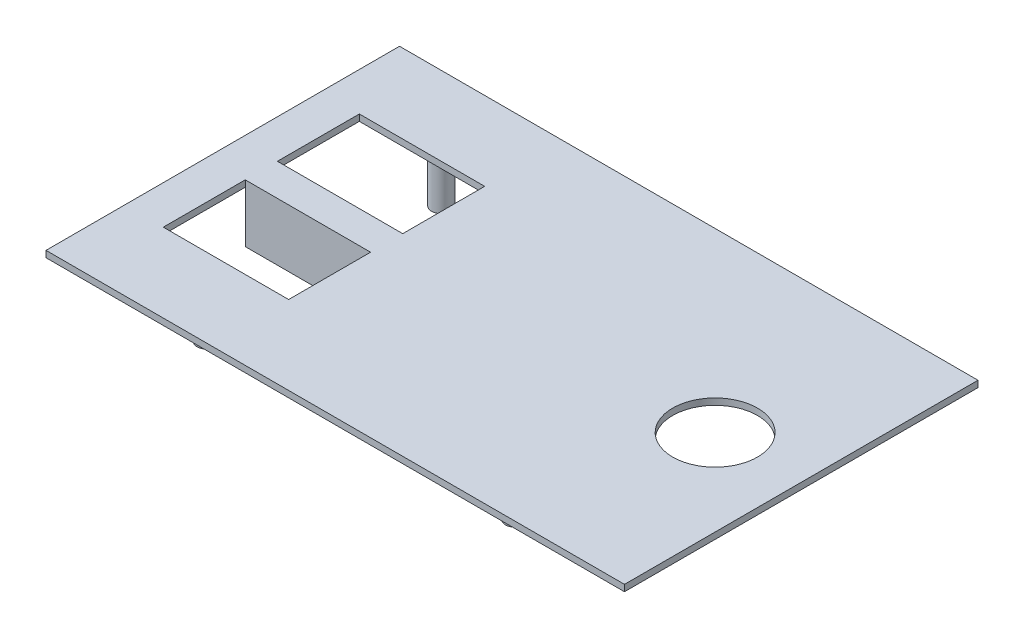
ISO-10303-21;
HEADER;
FILE_DESCRIPTION(('STEP AP214'),'2;1');
FILE_NAME('part.step','',(''),(''),'','','');
FILE_SCHEMA(('AUTOMOTIVE_DESIGN { 1 0 10303 214 1 1 1 1 }'));
ENDSEC;
DATA;
#1=APPLICATION_CONTEXT('core data for automotive mechanical design processes');
#2=APPLICATION_PROTOCOL_DEFINITION('international standard','automotive_design',2000,#1);
#3=PRODUCT_CONTEXT('',#1,'mechanical');
#4=PRODUCT('Part','Part','',(#3));
#5=PRODUCT_RELATED_PRODUCT_CATEGORY('part','',(#4));
#6=PRODUCT_DEFINITION_FORMATION('','',#4);
#7=PRODUCT_DEFINITION_CONTEXT('part definition',#1,'design');
#8=PRODUCT_DEFINITION('design','',#6,#7);
#9=PRODUCT_DEFINITION_SHAPE('','',#8);
#10=(LENGTH_UNIT() NAMED_UNIT(*) SI_UNIT(.MILLI.,.METRE.));
#11=(NAMED_UNIT(*) PLANE_ANGLE_UNIT() SI_UNIT($,.RADIAN.));
#12=(NAMED_UNIT(*) SI_UNIT($,.STERADIAN.) SOLID_ANGLE_UNIT());
#13=UNCERTAINTY_MEASURE_WITH_UNIT(LENGTH_MEASURE(1.E-05),#10,'distance_accuracy_value','');
#14=(GEOMETRIC_REPRESENTATION_CONTEXT(3) GLOBAL_UNCERTAINTY_ASSIGNED_CONTEXT((#13)) GLOBAL_UNIT_ASSIGNED_CONTEXT((#10,
#11,#12)) REPRESENTATION_CONTEXT('',''));
#15=CARTESIAN_POINT('',(0.,0.,0.));
#16=DIRECTION('',(0.,0.,1.));
#17=DIRECTION('',(1.,0.,0.));
#18=AXIS2_PLACEMENT_3D('',#15,#16,#17);
#19=CARTESIAN_POINT('',(0.,0.,0.));
#20=DIRECTION('',(0.,-1.,0.));
#21=DIRECTION('',(0.,0.,-1.));
#22=AXIS2_PLACEMENT_3D('',#19,#20,#21);
#23=PLANE('',#22);
#24=CARTESIAN_POINT('',(63.75,0.,-27.4111267518974));
#25=DIRECTION('',(0.,-1.,0.));
#26=DIRECTION('',(0.,0.,-1.));
#27=AXIS2_PLACEMENT_3D('',#24,#25,#26);
#28=CIRCLE('',#27,1.5);
#29=CARTESIAN_POINT('',(63.75,0.,-28.9111267518974));
#30=VERTEX_POINT('',#29);
#31=EDGE_CURVE('E546',#30,#30,#28,.T.);
#32=ORIENTED_EDGE('',*,*,#31,.F.);
#33=EDGE_LOOP('',(#32));
#34=FACE_BOUND('',#33,.T.);
#35=CARTESIAN_POINT('',(63.75,0.,-45.75));
#36=DIRECTION('',(0.,-1.,0.));
#37=DIRECTION('',(0.,0.,-1.));
#38=AXIS2_PLACEMENT_3D('',#35,#36,#37);
#39=CIRCLE('',#38,1.5);
#40=CARTESIAN_POINT('',(63.75,0.,-47.25));
#41=VERTEX_POINT('',#40);
#42=EDGE_CURVE('E162',#41,#41,#39,.T.);
#43=ORIENTED_EDGE('',*,*,#42,.F.);
#44=EDGE_LOOP('',(#43));
#45=FACE_BOUND('',#44,.T.);
#46=CARTESIAN_POINT('',(15.75,0.,-45.75));
#47=DIRECTION('',(0.,-1.,0.));
#48=DIRECTION('',(0.,0.,-1.));
#49=AXIS2_PLACEMENT_3D('',#46,#47,#48);
#50=CIRCLE('',#49,1.5);
#51=CARTESIAN_POINT('',(15.75,0.,-47.25));
#52=VERTEX_POINT('',#51);
#53=EDGE_CURVE('E177',#52,#52,#50,.T.);
#54=ORIENTED_EDGE('',*,*,#53,.F.);
#55=EDGE_LOOP('',(#54));
#56=FACE_BOUND('',#55,.T.);
#57=CARTESIAN_POINT('',(76.6,0.,-27.5));
#58=DIRECTION('',(0.,1.,0.));
#59=DIRECTION('',(0.,0.,1.));
#60=AXIS2_PLACEMENT_3D('',#57,#58,#59);
#61=CIRCLE('',#60,6.59999999999999);
#62=CARTESIAN_POINT('',(76.6,0.,-20.9));
#63=VERTEX_POINT('',#62);
#64=EDGE_CURVE('E195',#63,#63,#61,.T.);
#65=ORIENTED_EDGE('',*,*,#64,.T.);
#66=EDGE_LOOP('',(#65));
#67=FACE_BOUND('',#66,.T.);
#68=DIRECTION('',(0.,0.,1.));
#69=VECTOR('',#68,1.);
#70=CARTESIAN_POINT('',(0.,0.,0.));
#71=LINE('',#70,#69);
#72=CARTESIAN_POINT('',(0.,0.,-55.));
#73=VERTEX_POINT('',#72);
#74=CARTESIAN_POINT('',(0.,0.,0.));
#75=VERTEX_POINT('',#74);
#76=EDGE_CURVE('E247',#73,#75,#71,.T.);
#77=ORIENTED_EDGE('',*,*,#76,.F.);
#78=DIRECTION('',(-1.,0.,0.));
#79=VECTOR('',#78,1.);
#80=CARTESIAN_POINT('',(0.,0.,-55.));
#81=LINE('',#80,#79);
#82=CARTESIAN_POINT('',(90.,0.,-55.));
#83=VERTEX_POINT('',#82);
#84=EDGE_CURVE('E257',#83,#73,#81,.T.);
#85=ORIENTED_EDGE('',*,*,#84,.F.);
#86=DIRECTION('',(0.,0.,-1.));
#87=VECTOR('',#86,1.);
#88=CARTESIAN_POINT('',(90.,0.,0.));
#89=LINE('',#88,#87);
#90=CARTESIAN_POINT('',(90.,0.,0.));
#91=VERTEX_POINT('',#90);
#92=EDGE_CURVE('E268',#91,#83,#89,.T.);
#93=ORIENTED_EDGE('',*,*,#92,.F.);
#94=DIRECTION('',(1.,0.,0.));
#95=VECTOR('',#94,1.);
#96=CARTESIAN_POINT('',(0.,0.,0.));
#97=LINE('',#96,#95);
#98=EDGE_CURVE('E266',#75,#91,#97,.T.);
#99=ORIENTED_EDGE('',*,*,#98,.F.);
#100=EDGE_LOOP('',(#77,#85,#93,#99));
#101=FACE_BOUND('',#100,.T.);
#102=CARTESIAN_POINT('',(15.75,0.,-9.25));
#103=DIRECTION('',(0.,-1.,0.));
#104=DIRECTION('',(0.,0.,-1.));
#105=AXIS2_PLACEMENT_3D('',#102,#103,#104);
#106=CIRCLE('',#105,1.5);
#107=CARTESIAN_POINT('',(15.75,0.,-10.75));
#108=VERTEX_POINT('',#107);
#109=EDGE_CURVE('E188',#108,#108,#106,.T.);
#110=ORIENTED_EDGE('',*,*,#109,.F.);
#111=EDGE_LOOP('',(#110));
#112=FACE_BOUND('',#111,.T.);
#113=CARTESIAN_POINT('',(63.75,0.,-9.25));
#114=DIRECTION('',(0.,-1.,0.));
#115=DIRECTION('',(0.,0.,-1.));
#116=AXIS2_PLACEMENT_3D('',#113,#114,#115);
#117=CIRCLE('',#116,1.5);
#118=CARTESIAN_POINT('',(63.75,0.,-10.75));
#119=VERTEX_POINT('',#118);
#120=EDGE_CURVE('E172',#119,#119,#117,.T.);
#121=ORIENTED_EDGE('',*,*,#120,.F.);
#122=EDGE_LOOP('',(#121));
#123=FACE_BOUND('',#122,.T.);
#124=DIRECTION('',(0.,0.,1.));
#125=VECTOR('',#124,1.);
#126=CARTESIAN_POINT('',(6.,0.,-42.75));
#127=LINE('',#126,#125);
#128=CARTESIAN_POINT('',(6.,0.,-42.75));
#129=VERTEX_POINT('',#128);
#130=CARTESIAN_POINT('',(6.00000000000001,0.,-30.));
#131=VERTEX_POINT('',#130);
#132=EDGE_CURVE('E226',#129,#131,#127,.T.);
#133=ORIENTED_EDGE('',*,*,#132,.T.);
#134=DIRECTION('',(0.,0.,-1.));
#135=VECTOR('',#134,1.);
#136=CARTESIAN_POINT('',(6.,0.,-25.));
#137=LINE('',#136,#135);
#138=CARTESIAN_POINT('',(6.,0.,-25.));
#139=VERTEX_POINT('',#138);
#140=EDGE_CURVE('E161',#139,#131,#137,.T.);
#141=ORIENTED_EDGE('',*,*,#140,.F.);
#142=DIRECTION('',(0.,0.,1.));
#143=VECTOR('',#142,1.);
#144=CARTESIAN_POINT('',(6.,0.,-25.));
#145=LINE('',#144,#143);
#146=CARTESIAN_POINT('',(6.,0.,-12.25));
#147=VERTEX_POINT('',#146);
#148=EDGE_CURVE('E200',#139,#147,#145,.T.);
#149=ORIENTED_EDGE('',*,*,#148,.T.);
#150=DIRECTION('',(1.,0.,0.));
#151=VECTOR('',#150,1.);
#152=CARTESIAN_POINT('',(6.,0.,-12.25));
#153=LINE('',#152,#151);
#154=CARTESIAN_POINT('',(25.5,0.,-12.25));
#155=VERTEX_POINT('',#154);
#156=EDGE_CURVE('E203',#147,#155,#153,.T.);
#157=ORIENTED_EDGE('',*,*,#156,.T.);
#158=DIRECTION('',(0.,0.,-1.));
#159=VECTOR('',#158,1.);
#160=CARTESIAN_POINT('',(25.5,0.,-25.));
#161=LINE('',#160,#159);
#162=CARTESIAN_POINT('',(25.5,0.,-25.));
#163=VERTEX_POINT('',#162);
#164=EDGE_CURVE('E56',#155,#163,#161,.T.);
#165=ORIENTED_EDGE('',*,*,#164,.T.);
#166=DIRECTION('',(0.,0.,1.));
#167=VECTOR('',#166,1.);
#168=CARTESIAN_POINT('',(25.5,0.,-25.));
#169=LINE('',#168,#167);
#170=CARTESIAN_POINT('',(25.5,0.,-30.));
#171=VERTEX_POINT('',#170);
#172=EDGE_CURVE('E157',#171,#163,#169,.T.);
#173=ORIENTED_EDGE('',*,*,#172,.F.);
#174=DIRECTION('',(0.,0.,-1.));
#175=VECTOR('',#174,1.);
#176=CARTESIAN_POINT('',(25.5,0.,-42.75));
#177=LINE('',#176,#175);
#178=CARTESIAN_POINT('',(25.5,0.,-42.75));
#179=VERTEX_POINT('',#178);
#180=EDGE_CURVE('E229',#171,#179,#177,.T.);
#181=ORIENTED_EDGE('',*,*,#180,.T.);
#182=DIRECTION('',(-1.,0.,0.));
#183=VECTOR('',#182,1.);
#184=CARTESIAN_POINT('',(6.,0.,-42.75));
#185=LINE('',#184,#183);
#186=EDGE_CURVE('E233',#179,#129,#185,.T.);
#187=ORIENTED_EDGE('',*,*,#186,.T.);
#188=EDGE_LOOP('',(#133,#141,#149,#157,#165,#173,#181,#187));
#189=FACE_BOUND('',#188,.T.);
#190=CARTESIAN_POINT('',(42.2893659328708,0.,-27.4111267518974));
#191=DIRECTION('',(0.,-1.,0.));
#192=DIRECTION('',(0.,0.,-1.));
#193=AXIS2_PLACEMENT_3D('',#190,#191,#192);
#194=CIRCLE('',#193,1.5);
#195=CARTESIAN_POINT('',(42.2893659328708,0.,-28.9111267518974));
#196=VERTEX_POINT('',#195);
#197=EDGE_CURVE('E547',#196,#196,#194,.T.);
#198=ORIENTED_EDGE('',*,*,#197,.F.);
#199=EDGE_LOOP('',(#198));
#200=FACE_BOUND('',#199,.T.);
#201=ADVANCED_FACE('F33',(#34,#45,#56,#67,#101,#112,#123,#189,#200),#23,.T.);
#202=CARTESIAN_POINT('',(0.,1.,0.));
#203=DIRECTION('',(1.,0.,0.));
#204=DIRECTION('',(0.,0.,-1.));
#205=AXIS2_PLACEMENT_3D('',#202,#203,#204);
#206=PLANE('',#205);
#207=ORIENTED_EDGE('',*,*,#76,.T.);
#208=DIRECTION('',(0.,-1.,0.));
#209=VECTOR('',#208,1.);
#210=CARTESIAN_POINT('',(0.,1.,0.));
#211=LINE('',#210,#209);
#212=CARTESIAN_POINT('',(0.,1.,0.));
#213=VERTEX_POINT('',#212);
#214=EDGE_CURVE('E41',#213,#75,#211,.T.);
#215=ORIENTED_EDGE('',*,*,#214,.F.);
#216=DIRECTION('',(0.,0.,1.));
#217=VECTOR('',#216,1.);
#218=CARTESIAN_POINT('',(0.,1.,0.));
#219=LINE('',#218,#217);
#220=CARTESIAN_POINT('',(0.,1.,-55.));
#221=VERTEX_POINT('',#220);
#222=EDGE_CURVE('E253',#221,#213,#219,.T.);
#223=ORIENTED_EDGE('',*,*,#222,.F.);
#224=DIRECTION('',(0.,-1.,0.));
#225=VECTOR('',#224,1.);
#226=CARTESIAN_POINT('',(0.,1.,-55.));
#227=LINE('',#226,#225);
#228=EDGE_CURVE('E263',#221,#73,#227,.T.);
#229=ORIENTED_EDGE('',*,*,#228,.T.);
#230=EDGE_LOOP('',(#207,#215,#223,#229));
#231=FACE_BOUND('',#230,.T.);
#232=ADVANCED_FACE('F35',(#231),#206,.F.);
#233=CARTESIAN_POINT('',(0.,1.,0.));
#234=DIRECTION('',(0.,0.,-1.));
#235=DIRECTION('',(-1.,0.,0.));
#236=AXIS2_PLACEMENT_3D('',#233,#234,#235);
#237=PLANE('',#236);
#238=ORIENTED_EDGE('',*,*,#98,.T.);
#239=DIRECTION('',(0.,-1.,0.));
#240=VECTOR('',#239,1.);
#241=CARTESIAN_POINT('',(90.,1.,0.));
#242=LINE('',#241,#240);
#243=CARTESIAN_POINT('',(90.,1.,0.));
#244=VERTEX_POINT('',#243);
#245=EDGE_CURVE('E276',#244,#91,#242,.T.);
#246=ORIENTED_EDGE('',*,*,#245,.F.);
#247=DIRECTION('',(1.,0.,0.));
#248=VECTOR('',#247,1.);
#249=CARTESIAN_POINT('',(0.,1.,0.));
#250=LINE('',#249,#248);
#251=EDGE_CURVE('E256',#213,#244,#250,.T.);
#252=ORIENTED_EDGE('',*,*,#251,.F.);
#253=ORIENTED_EDGE('',*,*,#214,.T.);
#254=EDGE_LOOP('',(#238,#246,#252,#253));
#255=FACE_BOUND('',#254,.T.);
#256=ADVANCED_FACE('F281',(#255),#237,.F.);
#257=CARTESIAN_POINT('',(90.,1.,0.));
#258=DIRECTION('',(-1.,0.,0.));
#259=DIRECTION('',(0.,0.,1.));
#260=AXIS2_PLACEMENT_3D('',#257,#258,#259);
#261=PLANE('',#260);
#262=ORIENTED_EDGE('',*,*,#92,.T.);
#263=DIRECTION('',(0.,-1.,0.));
#264=VECTOR('',#263,1.);
#265=CARTESIAN_POINT('',(90.,1.,-55.));
#266=LINE('',#265,#264);
#267=CARTESIAN_POINT('',(90.,1.,-55.));
#268=VERTEX_POINT('',#267);
#269=EDGE_CURVE('E273',#268,#83,#266,.T.);
#270=ORIENTED_EDGE('',*,*,#269,.F.);
#271=DIRECTION('',(0.,0.,-1.));
#272=VECTOR('',#271,1.);
#273=CARTESIAN_POINT('',(90.,1.,0.));
#274=LINE('',#273,#272);
#275=EDGE_CURVE('E259',#244,#268,#274,.T.);
#276=ORIENTED_EDGE('',*,*,#275,.F.);
#277=ORIENTED_EDGE('',*,*,#245,.T.);
#278=EDGE_LOOP('',(#262,#270,#276,#277));
#279=FACE_BOUND('',#278,.T.);
#280=ADVANCED_FACE('F293',(#279),#261,.F.);
#281=CARTESIAN_POINT('',(0.,1.,-55.));
#282=DIRECTION('',(0.,0.,1.));
#283=DIRECTION('',(1.,0.,0.));
#284=AXIS2_PLACEMENT_3D('',#281,#282,#283);
#285=PLANE('',#284);
#286=ORIENTED_EDGE('',*,*,#84,.T.);
#287=ORIENTED_EDGE('',*,*,#228,.F.);
#288=DIRECTION('',(-1.,0.,0.));
#289=VECTOR('',#288,1.);
#290=CARTESIAN_POINT('',(0.,1.,-55.));
#291=LINE('',#290,#289);
#292=EDGE_CURVE('E261',#268,#221,#291,.T.);
#293=ORIENTED_EDGE('',*,*,#292,.F.);
#294=ORIENTED_EDGE('',*,*,#269,.T.);
#295=EDGE_LOOP('',(#286,#287,#293,#294));
#296=FACE_BOUND('',#295,.T.);
#297=ADVANCED_FACE('F297',(#296),#285,.F.);
#298=CARTESIAN_POINT('',(0.,1.,0.));
#299=DIRECTION('',(0.,-1.,0.));
#300=DIRECTION('',(0.,0.,-1.));
#301=AXIS2_PLACEMENT_3D('',#298,#299,#300);
#302=PLANE('',#301);
#303=CARTESIAN_POINT('',(76.6,1.,-27.5));
#304=DIRECTION('',(0.,1.,0.));
#305=DIRECTION('',(0.,0.,1.));
#306=AXIS2_PLACEMENT_3D('',#303,#304,#305);
#307=CIRCLE('',#306,6.59999999999999);
#308=CARTESIAN_POINT('',(76.6,1.,-20.9));
#309=VERTEX_POINT('',#308);
#310=EDGE_CURVE('E192',#309,#309,#307,.T.);
#311=ORIENTED_EDGE('',*,*,#310,.F.);
#312=EDGE_LOOP('',(#311));
#313=FACE_BOUND('',#312,.T.);
#314=DIRECTION('',(1.,0.,0.));
#315=VECTOR('',#314,1.);
#316=CARTESIAN_POINT('',(6.,1.,-12.25));
#317=LINE('',#316,#315);
#318=CARTESIAN_POINT('',(6.,1.,-12.25));
#319=VERTEX_POINT('',#318);
#320=CARTESIAN_POINT('',(25.5,1.,-12.25));
#321=VERTEX_POINT('',#320);
#322=EDGE_CURVE('E210',#319,#321,#317,.T.);
#323=ORIENTED_EDGE('',*,*,#322,.F.);
#324=DIRECTION('',(0.,0.,1.));
#325=VECTOR('',#324,1.);
#326=CARTESIAN_POINT('',(6.,1.,-25.));
#327=LINE('',#326,#325);
#328=CARTESIAN_POINT('',(6.,1.,-25.));
#329=VERTEX_POINT('',#328);
#330=EDGE_CURVE('E48',#329,#319,#327,.T.);
#331=ORIENTED_EDGE('',*,*,#330,.F.);
#332=DIRECTION('',(-1.,0.,0.));
#333=VECTOR('',#332,1.);
#334=CARTESIAN_POINT('',(6.,1.,-25.));
#335=LINE('',#334,#333);
#336=CARTESIAN_POINT('',(25.5,1.,-25.));
#337=VERTEX_POINT('',#336);
#338=EDGE_CURVE('E204',#337,#329,#335,.T.);
#339=ORIENTED_EDGE('',*,*,#338,.F.);
#340=DIRECTION('',(0.,0.,-1.));
#341=VECTOR('',#340,1.);
#342=CARTESIAN_POINT('',(25.5,1.,-25.));
#343=LINE('',#342,#341);
#344=EDGE_CURVE('E213',#321,#337,#343,.T.);
#345=ORIENTED_EDGE('',*,*,#344,.F.);
#346=EDGE_LOOP('',(#323,#331,#339,#345));
#347=FACE_BOUND('',#346,.T.);
#348=DIRECTION('',(1.,0.,0.));
#349=VECTOR('',#348,1.);
#350=CARTESIAN_POINT('',(6.00000000000001,1.,-30.));
#351=LINE('',#350,#349);
#352=CARTESIAN_POINT('',(6.00000000000001,1.,-30.));
#353=VERTEX_POINT('',#352);
#354=CARTESIAN_POINT('',(25.5,1.,-30.));
#355=VERTEX_POINT('',#354);
#356=EDGE_CURVE('E238',#353,#355,#351,.T.);
#357=ORIENTED_EDGE('',*,*,#356,.F.);
#358=DIRECTION('',(0.,0.,1.));
#359=VECTOR('',#358,1.);
#360=CARTESIAN_POINT('',(6.,1.,-42.75));
#361=LINE('',#360,#359);
#362=CARTESIAN_POINT('',(6.,1.,-42.75));
#363=VERTEX_POINT('',#362);
#364=EDGE_CURVE('E220',#363,#353,#361,.T.);
#365=ORIENTED_EDGE('',*,*,#364,.F.);
#366=DIRECTION('',(-1.,0.,0.));
#367=VECTOR('',#366,1.);
#368=CARTESIAN_POINT('',(6.,1.,-42.75));
#369=LINE('',#368,#367);
#370=CARTESIAN_POINT('',(25.5,1.,-42.75));
#371=VERTEX_POINT('',#370);
#372=EDGE_CURVE('E230',#371,#363,#369,.T.);
#373=ORIENTED_EDGE('',*,*,#372,.F.);
#374=DIRECTION('',(0.,0.,-1.));
#375=VECTOR('',#374,1.);
#376=CARTESIAN_POINT('',(25.5,1.,-42.75));
#377=LINE('',#376,#375);
#378=EDGE_CURVE('E240',#355,#371,#377,.T.);
#379=ORIENTED_EDGE('',*,*,#378,.F.);
#380=EDGE_LOOP('',(#357,#365,#373,#379));
#381=FACE_BOUND('',#380,.T.);
#382=ORIENTED_EDGE('',*,*,#222,.T.);
#383=ORIENTED_EDGE('',*,*,#251,.T.);
#384=ORIENTED_EDGE('',*,*,#275,.T.);
#385=ORIENTED_EDGE('',*,*,#292,.T.);
#386=EDGE_LOOP('',(#382,#383,#384,#385));
#387=FACE_BOUND('',#386,.T.);
#388=ADVANCED_FACE('F299',(#313,#347,#381,#387),#302,.F.);
#389=CARTESIAN_POINT('',(6.,0.,-42.75));
#390=DIRECTION('',(-1.,0.,0.));
#391=DIRECTION('',(0.,0.,1.));
#392=AXIS2_PLACEMENT_3D('',#389,#390,#391);
#393=PLANE('',#392);
#394=ORIENTED_EDGE('',*,*,#364,.T.);
#395=DIRECTION('',(0.,1.,0.));
#396=VECTOR('',#395,1.);
#397=CARTESIAN_POINT('',(6.00000000000001,0.,-30.));
#398=LINE('',#397,#396);
#399=EDGE_CURVE('E236',#131,#353,#398,.T.);
#400=ORIENTED_EDGE('',*,*,#399,.F.);
#401=ORIENTED_EDGE('',*,*,#132,.F.);
#402=DIRECTION('',(0.,1.,0.));
#403=VECTOR('',#402,1.);
#404=CARTESIAN_POINT('',(6.,0.,-42.75));
#405=LINE('',#404,#403);
#406=EDGE_CURVE('E245',#129,#363,#405,.T.);
#407=ORIENTED_EDGE('',*,*,#406,.T.);
#408=EDGE_LOOP('',(#394,#400,#401,#407));
#409=FACE_BOUND('',#408,.T.);
#410=ADVANCED_FACE('F301',(#409),#393,.F.);
#411=CARTESIAN_POINT('',(6.,0.,-42.75));
#412=DIRECTION('',(0.,0.,-1.));
#413=DIRECTION('',(-1.,0.,0.));
#414=AXIS2_PLACEMENT_3D('',#411,#412,#413);
#415=PLANE('',#414);
#416=ORIENTED_EDGE('',*,*,#372,.T.);
#417=ORIENTED_EDGE('',*,*,#406,.F.);
#418=ORIENTED_EDGE('',*,*,#186,.F.);
#419=DIRECTION('',(0.,1.,0.));
#420=VECTOR('',#419,1.);
#421=CARTESIAN_POINT('',(25.5,0.,-42.75));
#422=LINE('',#421,#420);
#423=EDGE_CURVE('E248',#179,#371,#422,.T.);
#424=ORIENTED_EDGE('',*,*,#423,.T.);
#425=EDGE_LOOP('',(#416,#417,#418,#424));
#426=FACE_BOUND('',#425,.T.);
#427=ADVANCED_FACE('F308',(#426),#415,.F.);
#428=CARTESIAN_POINT('',(25.5,0.,-42.75));
#429=DIRECTION('',(1.,0.,0.));
#430=DIRECTION('',(0.,0.,-1.));
#431=AXIS2_PLACEMENT_3D('',#428,#429,#430);
#432=PLANE('',#431);
#433=ORIENTED_EDGE('',*,*,#378,.T.);
#434=ORIENTED_EDGE('',*,*,#423,.F.);
#435=ORIENTED_EDGE('',*,*,#180,.F.);
#436=DIRECTION('',(0.,1.,0.));
#437=VECTOR('',#436,1.);
#438=CARTESIAN_POINT('',(25.5,0.,-30.));
#439=LINE('',#438,#437);
#440=EDGE_CURVE('E250',#171,#355,#439,.T.);
#441=ORIENTED_EDGE('',*,*,#440,.T.);
#442=EDGE_LOOP('',(#433,#434,#435,#441));
#443=FACE_BOUND('',#442,.T.);
#444=ADVANCED_FACE('F370',(#443),#432,.F.);
#445=CARTESIAN_POINT('',(6.00000000000001,0.,-30.));
#446=DIRECTION('',(0.,0.,1.));
#447=DIRECTION('',(1.,0.,0.));
#448=AXIS2_PLACEMENT_3D('',#445,#446,#447);
#449=PLANE('',#448);
#450=ORIENTED_EDGE('',*,*,#356,.T.);
#451=ORIENTED_EDGE('',*,*,#440,.F.);
#452=DIRECTION('',(0.,1.,0.));
#453=VECTOR('',#452,1.);
#454=CARTESIAN_POINT('',(25.5,-8.,-30.));
#455=LINE('',#454,#453);
#456=CARTESIAN_POINT('',(25.5,-8.,-30.));
#457=VERTEX_POINT('',#456);
#458=EDGE_CURVE('E144',#457,#171,#455,.T.);
#459=ORIENTED_EDGE('',*,*,#458,.F.);
#460=DIRECTION('',(1.,0.,0.));
#461=VECTOR('',#460,1.);
#462=CARTESIAN_POINT('',(6.,-8.,-30.));
#463=LINE('',#462,#461);
#464=CARTESIAN_POINT('',(6.,-8.,-30.));
#465=VERTEX_POINT('',#464);
#466=EDGE_CURVE('E134',#465,#457,#463,.T.);
#467=ORIENTED_EDGE('',*,*,#466,.F.);
#468=DIRECTION('',(0.,1.,0.));
#469=VECTOR('',#468,1.);
#470=CARTESIAN_POINT('',(6.,-8.,-30.));
#471=LINE('',#470,#469);
#472=EDGE_CURVE('E140',#465,#131,#471,.T.);
#473=ORIENTED_EDGE('',*,*,#472,.T.);
#474=ORIENTED_EDGE('',*,*,#399,.T.);
#475=EDGE_LOOP('',(#450,#451,#459,#467,#473,#474));
#476=FACE_BOUND('',#475,.T.);
#477=ADVANCED_FACE('F137',(#476),#449,.F.);
#478=CARTESIAN_POINT('',(6.,0.,-25.));
#479=DIRECTION('',(-1.,0.,0.));
#480=DIRECTION('',(0.,0.,1.));
#481=AXIS2_PLACEMENT_3D('',#478,#479,#480);
#482=PLANE('',#481);
#483=ORIENTED_EDGE('',*,*,#330,.T.);
#484=DIRECTION('',(0.,1.,0.));
#485=VECTOR('',#484,1.);
#486=CARTESIAN_POINT('',(6.,0.,-12.25));
#487=LINE('',#486,#485);
#488=EDGE_CURVE('E208',#147,#319,#487,.T.);
#489=ORIENTED_EDGE('',*,*,#488,.F.);
#490=ORIENTED_EDGE('',*,*,#148,.F.);
#491=DIRECTION('',(0.,1.,0.));
#492=VECTOR('',#491,1.);
#493=CARTESIAN_POINT('',(6.,0.,-25.));
#494=LINE('',#493,#492);
#495=EDGE_CURVE('E218',#139,#329,#494,.T.);
#496=ORIENTED_EDGE('',*,*,#495,.T.);
#497=EDGE_LOOP('',(#483,#489,#490,#496));
#498=FACE_BOUND('',#497,.T.);
#499=ADVANCED_FACE('F359',(#498),#482,.F.);
#500=CARTESIAN_POINT('',(6.,0.,-25.));
#501=DIRECTION('',(0.,0.,-1.));
#502=DIRECTION('',(-1.,0.,0.));
#503=AXIS2_PLACEMENT_3D('',#500,#501,#502);
#504=PLANE('',#503);
#505=ORIENTED_EDGE('',*,*,#338,.T.);
#506=ORIENTED_EDGE('',*,*,#495,.F.);
#507=DIRECTION('',(0.,1.,0.));
#508=VECTOR('',#507,1.);
#509=CARTESIAN_POINT('',(6.,-8.,-25.));
#510=LINE('',#509,#508);
#511=CARTESIAN_POINT('',(6.,-8.,-25.));
#512=VERTEX_POINT('',#511);
#513=EDGE_CURVE('E559',#512,#139,#510,.T.);
#514=ORIENTED_EDGE('',*,*,#513,.F.);
#515=DIRECTION('',(-1.,0.,0.));
#516=VECTOR('',#515,1.);
#517=CARTESIAN_POINT('',(6.,-8.,-25.));
#518=LINE('',#517,#516);
#519=CARTESIAN_POINT('',(25.5,-8.,-25.));
#520=VERTEX_POINT('',#519);
#521=EDGE_CURVE('E153',#520,#512,#518,.T.);
#522=ORIENTED_EDGE('',*,*,#521,.F.);
#523=DIRECTION('',(0.,1.,0.));
#524=VECTOR('',#523,1.);
#525=CARTESIAN_POINT('',(25.5,-8.,-25.));
#526=LINE('',#525,#524);
#527=EDGE_CURVE('E167',#520,#163,#526,.T.);
#528=ORIENTED_EDGE('',*,*,#527,.T.);
#529=DIRECTION('',(0.,1.,0.));
#530=VECTOR('',#529,1.);
#531=CARTESIAN_POINT('',(25.5,0.,-25.));
#532=LINE('',#531,#530);
#533=EDGE_CURVE('E221',#163,#337,#532,.T.);
#534=ORIENTED_EDGE('',*,*,#533,.T.);
#535=EDGE_LOOP('',(#505,#506,#514,#522,#528,#534));
#536=FACE_BOUND('',#535,.T.);
#537=ADVANCED_FACE('F355',(#536),#504,.F.);
#538=CARTESIAN_POINT('',(25.5,0.,-25.));
#539=DIRECTION('',(1.,0.,0.));
#540=DIRECTION('',(0.,0.,-1.));
#541=AXIS2_PLACEMENT_3D('',#538,#539,#540);
#542=PLANE('',#541);
#543=ORIENTED_EDGE('',*,*,#344,.T.);
#544=ORIENTED_EDGE('',*,*,#533,.F.);
#545=ORIENTED_EDGE('',*,*,#164,.F.);
#546=DIRECTION('',(0.,1.,0.));
#547=VECTOR('',#546,1.);
#548=CARTESIAN_POINT('',(25.5,0.,-12.25));
#549=LINE('',#548,#547);
#550=EDGE_CURVE('E223',#155,#321,#549,.T.);
#551=ORIENTED_EDGE('',*,*,#550,.T.);
#552=EDGE_LOOP('',(#543,#544,#545,#551));
#553=FACE_BOUND('',#552,.T.);
#554=ADVANCED_FACE('F358',(#553),#542,.F.);
#555=CARTESIAN_POINT('',(6.,0.,-12.25));
#556=DIRECTION('',(0.,0.,1.));
#557=DIRECTION('',(1.,0.,0.));
#558=AXIS2_PLACEMENT_3D('',#555,#556,#557);
#559=PLANE('',#558);
#560=ORIENTED_EDGE('',*,*,#322,.T.);
#561=ORIENTED_EDGE('',*,*,#550,.F.);
#562=ORIENTED_EDGE('',*,*,#156,.F.);
#563=ORIENTED_EDGE('',*,*,#488,.T.);
#564=EDGE_LOOP('',(#560,#561,#562,#563));
#565=FACE_BOUND('',#564,.T.);
#566=ADVANCED_FACE('F353',(#565),#559,.F.);
#567=CARTESIAN_POINT('',(76.6,0.,-27.5));
#568=DIRECTION('',(0.,1.,0.));
#569=DIRECTION('',(0.,0.,1.));
#570=AXIS2_PLACEMENT_3D('',#567,#568,#569);
#571=CYLINDRICAL_SURFACE('',#570,6.59999999999999);
#572=ORIENTED_EDGE('',*,*,#64,.F.);
#573=EDGE_LOOP('',(#572));
#574=FACE_BOUND('',#573,.T.);
#575=ORIENTED_EDGE('',*,*,#310,.T.);
#576=EDGE_LOOP('',(#575));
#577=FACE_BOUND('',#576,.T.);
#578=ADVANCED_FACE('F348',(#574,#577),#571,.F.);
#579=CARTESIAN_POINT('',(15.75,-8.,-9.25));
#580=DIRECTION('',(0.,-1.,0.));
#581=DIRECTION('',(0.,0.,-1.));
#582=AXIS2_PLACEMENT_3D('',#579,#580,#581);
#583=PLANE('',#582);
#584=CARTESIAN_POINT('',(15.75,-8.,-9.25));
#585=DIRECTION('',(0.,-1.,0.));
#586=DIRECTION('',(0.,0.,-1.));
#587=AXIS2_PLACEMENT_3D('',#584,#585,#586);
#588=CIRCLE('',#587,1.5);
#589=CARTESIAN_POINT('',(15.75,-8.,-10.75));
#590=VERTEX_POINT('',#589);
#591=EDGE_CURVE('E189',#590,#590,#588,.T.);
#592=ORIENTED_EDGE('',*,*,#591,.T.);
#593=EDGE_LOOP('',(#592));
#594=FACE_BOUND('',#593,.T.);
#595=CARTESIAN_POINT('',(15.75,-8.,-9.25));
#596=DIRECTION('',(0.,-1.,0.));
#597=DIRECTION('',(0.,0.,-1.));
#598=AXIS2_PLACEMENT_3D('',#595,#596,#597);
#599=CIRCLE('',#598,0.194235626982939);
#600=CARTESIAN_POINT('',(15.75,-8.,-9.44423562698294));
#601=VERTEX_POINT('',#600);
#602=EDGE_CURVE('E183',#601,#601,#599,.T.);
#603=ORIENTED_EDGE('',*,*,#602,.F.);
#604=EDGE_LOOP('',(#603));
#605=FACE_BOUND('',#604,.T.);
#606=ADVANCED_FACE('F342',(#594,#605),#583,.T.);
#607=CARTESIAN_POINT('',(15.75,-8.,-9.25));
#608=DIRECTION('',(0.,1.,0.));
#609=DIRECTION('',(0.,0.,1.));
#610=AXIS2_PLACEMENT_3D('',#607,#608,#609);
#611=CYLINDRICAL_SURFACE('',#610,1.5);
#612=ORIENTED_EDGE('',*,*,#591,.F.);
#613=EDGE_LOOP('',(#612));
#614=FACE_BOUND('',#613,.T.);
#615=ORIENTED_EDGE('',*,*,#109,.T.);
#616=EDGE_LOOP('',(#615));
#617=FACE_BOUND('',#616,.T.);
#618=ADVANCED_FACE('F334',(#614,#617),#611,.T.);
#619=CARTESIAN_POINT('',(15.75,-8.,-9.25));
#620=DIRECTION('',(0.,1.,0.));
#621=DIRECTION('',(0.,0.,1.));
#622=AXIS2_PLACEMENT_3D('',#619,#620,#621);
#623=CYLINDRICAL_SURFACE('',#622,0.194235626982939);
#624=ORIENTED_EDGE('',*,*,#602,.T.);
#625=EDGE_LOOP('',(#624));
#626=FACE_BOUND('',#625,.T.);
#627=CARTESIAN_POINT('',(15.75,0.,-9.25));
#628=DIRECTION('',(0.,-1.,0.));
#629=DIRECTION('',(0.,0.,-1.));
#630=AXIS2_PLACEMENT_3D('',#627,#628,#629);
#631=CIRCLE('',#630,0.194235626982939);
#632=CARTESIAN_POINT('',(15.75,0.,-9.44423562698294));
#633=VERTEX_POINT('',#632);
#634=EDGE_CURVE('E11',#633,#633,#631,.F.);
#635=ORIENTED_EDGE('',*,*,#634,.T.);
#636=EDGE_LOOP('',(#635));
#637=FACE_BOUND('',#636,.T.);
#638=ADVANCED_FACE('F325',(#626,#637),#623,.F.);
#639=ORIENTED_EDGE('',*,*,#634,.F.);
#640=EDGE_LOOP('',(#639));
#641=FACE_BOUND('',#640,.T.);
#642=ADVANCED_FACE('F317',(#641),#23,.T.);
#643=CARTESIAN_POINT('',(15.75,-8.,-45.75));
#644=DIRECTION('',(0.,1.,0.));
#645=DIRECTION('',(0.,0.,1.));
#646=AXIS2_PLACEMENT_3D('',#643,#644,#645);
#647=CYLINDRICAL_SURFACE('',#646,1.5);
#648=CARTESIAN_POINT('',(15.75,-8.,-45.75));
#649=DIRECTION('',(0.,-1.,0.));
#650=DIRECTION('',(0.,0.,-1.));
#651=AXIS2_PLACEMENT_3D('',#648,#649,#650);
#652=CIRCLE('',#651,1.5);
#653=CARTESIAN_POINT('',(15.75,-8.,-47.25));
#654=VERTEX_POINT('',#653);
#655=EDGE_CURVE('E180',#654,#654,#652,.T.);
#656=ORIENTED_EDGE('',*,*,#655,.F.);
#657=EDGE_LOOP('',(#656));
#658=FACE_BOUND('',#657,.T.);
#659=ORIENTED_EDGE('',*,*,#53,.T.);
#660=EDGE_LOOP('',(#659));
#661=FACE_BOUND('',#660,.T.);
#662=ADVANCED_FACE('F324',(#658,#661),#647,.T.);
#663=CARTESIAN_POINT('',(15.75,-8.,-45.75));
#664=DIRECTION('',(0.,-1.,0.));
#665=DIRECTION('',(0.,0.,-1.));
#666=AXIS2_PLACEMENT_3D('',#663,#664,#665);
#667=PLANE('',#666);
#668=ORIENTED_EDGE('',*,*,#655,.T.);
#669=EDGE_LOOP('',(#668));
#670=FACE_BOUND('',#669,.T.);
#671=ADVANCED_FACE('F331',(#670),#667,.T.);
#672=CARTESIAN_POINT('',(63.75,-8.,-9.25));
#673=DIRECTION('',(0.,1.,0.));
#674=DIRECTION('',(0.,0.,1.));
#675=AXIS2_PLACEMENT_3D('',#672,#673,#674);
#676=CYLINDRICAL_SURFACE('',#675,1.5);
#677=CARTESIAN_POINT('',(63.75,-8.,-9.25));
#678=DIRECTION('',(0.,-1.,0.));
#679=DIRECTION('',(0.,0.,-1.));
#680=AXIS2_PLACEMENT_3D('',#677,#678,#679);
#681=CIRCLE('',#680,1.5);
#682=CARTESIAN_POINT('',(63.75,-8.,-10.75));
#683=VERTEX_POINT('',#682);
#684=EDGE_CURVE('E174',#683,#683,#681,.T.);
#685=ORIENTED_EDGE('',*,*,#684,.F.);
#686=EDGE_LOOP('',(#685));
#687=FACE_BOUND('',#686,.T.);
#688=ORIENTED_EDGE('',*,*,#120,.T.);
#689=EDGE_LOOP('',(#688));
#690=FACE_BOUND('',#689,.T.);
#691=ADVANCED_FACE('F434',(#687,#690),#676,.T.);
#692=CARTESIAN_POINT('',(63.75,-8.,-9.25));
#693=DIRECTION('',(0.,-1.,0.));
#694=DIRECTION('',(0.,0.,-1.));
#695=AXIS2_PLACEMENT_3D('',#692,#693,#694);
#696=PLANE('',#695);
#697=ORIENTED_EDGE('',*,*,#684,.T.);
#698=EDGE_LOOP('',(#697));
#699=FACE_BOUND('',#698,.T.);
#700=ADVANCED_FACE('F443',(#699),#696,.T.);
#701=CARTESIAN_POINT('',(63.75,-8.,-45.75));
#702=DIRECTION('',(0.,1.,0.));
#703=DIRECTION('',(0.,0.,1.));
#704=AXIS2_PLACEMENT_3D('',#701,#702,#703);
#705=CYLINDRICAL_SURFACE('',#704,1.5);
#706=CARTESIAN_POINT('',(63.75,-8.,-45.75));
#707=DIRECTION('',(0.,-1.,0.));
#708=DIRECTION('',(0.,0.,-1.));
#709=AXIS2_PLACEMENT_3D('',#706,#707,#708);
#710=CIRCLE('',#709,1.5);
#711=CARTESIAN_POINT('',(63.75,-8.,-47.25));
#712=VERTEX_POINT('',#711);
#713=EDGE_CURVE('E165',#712,#712,#710,.T.);
#714=ORIENTED_EDGE('',*,*,#713,.F.);
#715=EDGE_LOOP('',(#714));
#716=FACE_BOUND('',#715,.T.);
#717=ORIENTED_EDGE('',*,*,#42,.T.);
#718=EDGE_LOOP('',(#717));
#719=FACE_BOUND('',#718,.T.);
#720=ADVANCED_FACE('F453',(#716,#719),#705,.T.);
#721=CARTESIAN_POINT('',(63.75,-8.,-45.75));
#722=DIRECTION('',(0.,-1.,0.));
#723=DIRECTION('',(0.,0.,-1.));
#724=AXIS2_PLACEMENT_3D('',#721,#722,#723);
#725=PLANE('',#724);
#726=ORIENTED_EDGE('',*,*,#713,.T.);
#727=EDGE_LOOP('',(#726));
#728=FACE_BOUND('',#727,.T.);
#729=ADVANCED_FACE('F463',(#728),#725,.T.);
#730=CARTESIAN_POINT('',(6.,-8.,-25.));
#731=DIRECTION('',(1.,0.,0.));
#732=DIRECTION('',(0.,0.,-1.));
#733=AXIS2_PLACEMENT_3D('',#730,#731,#732);
#734=PLANE('',#733);
#735=ORIENTED_EDGE('',*,*,#140,.T.);
#736=ORIENTED_EDGE('',*,*,#472,.F.);
#737=DIRECTION('',(0.,0.,-1.));
#738=VECTOR('',#737,1.);
#739=CARTESIAN_POINT('',(6.,-8.,-25.));
#740=LINE('',#739,#738);
#741=EDGE_CURVE('E148',#512,#465,#740,.T.);
#742=ORIENTED_EDGE('',*,*,#741,.F.);
#743=ORIENTED_EDGE('',*,*,#513,.T.);
#744=EDGE_LOOP('',(#735,#736,#742,#743));
#745=FACE_BOUND('',#744,.T.);
#746=ADVANCED_FACE('F159',(#745),#734,.F.);
#747=CARTESIAN_POINT('',(25.5,-8.,-25.));
#748=DIRECTION('',(-1.,0.,0.));
#749=DIRECTION('',(0.,0.,1.));
#750=AXIS2_PLACEMENT_3D('',#747,#748,#749);
#751=PLANE('',#750);
#752=ORIENTED_EDGE('',*,*,#172,.T.);
#753=ORIENTED_EDGE('',*,*,#527,.F.);
#754=DIRECTION('',(0.,0.,1.));
#755=VECTOR('',#754,1.);
#756=CARTESIAN_POINT('',(25.5,-8.,-25.));
#757=LINE('',#756,#755);
#758=EDGE_CURVE('E147',#457,#520,#757,.T.);
#759=ORIENTED_EDGE('',*,*,#758,.F.);
#760=ORIENTED_EDGE('',*,*,#458,.T.);
#761=EDGE_LOOP('',(#752,#753,#759,#760));
#762=FACE_BOUND('',#761,.T.);
#763=ADVANCED_FACE('F482',(#762),#751,.F.);
#764=CARTESIAN_POINT('',(0.,-8.,0.));
#765=DIRECTION('',(0.,-1.,0.));
#766=DIRECTION('',(0.,0.,-1.));
#767=AXIS2_PLACEMENT_3D('',#764,#765,#766);
#768=PLANE('',#767);
#769=ORIENTED_EDGE('',*,*,#741,.T.);
#770=ORIENTED_EDGE('',*,*,#466,.T.);
#771=ORIENTED_EDGE('',*,*,#758,.T.);
#772=ORIENTED_EDGE('',*,*,#521,.T.);
#773=EDGE_LOOP('',(#769,#770,#771,#772));
#774=FACE_BOUND('',#773,.T.);
#775=ADVANCED_FACE('F151',(#774),#768,.T.);
#776=CARTESIAN_POINT('',(63.75,-8.,-27.4111267518974));
#777=DIRECTION('',(0.,1.,0.));
#778=DIRECTION('',(0.,0.,1.));
#779=AXIS2_PLACEMENT_3D('',#776,#777,#778);
#780=CYLINDRICAL_SURFACE('',#779,1.5);
#781=CARTESIAN_POINT('',(63.75,-8.,-27.4111267518974));
#782=DIRECTION('',(0.,-1.,0.));
#783=DIRECTION('',(0.,0.,-1.));
#784=AXIS2_PLACEMENT_3D('',#781,#782,#783);
#785=CIRCLE('',#784,1.5);
#786=CARTESIAN_POINT('',(63.75,-8.,-28.9111267518974));
#787=VERTEX_POINT('',#786);
#788=EDGE_CURVE('E550',#787,#787,#785,.T.);
#789=ORIENTED_EDGE('',*,*,#788,.F.);
#790=EDGE_LOOP('',(#789));
#791=FACE_BOUND('',#790,.T.);
#792=ORIENTED_EDGE('',*,*,#31,.T.);
#793=EDGE_LOOP('',(#792));
#794=FACE_BOUND('',#793,.T.);
#795=ADVANCED_FACE('F500',(#791,#794),#780,.T.);
#796=CARTESIAN_POINT('',(63.75,-8.,-27.4111267518974));
#797=DIRECTION('',(0.,-1.,0.));
#798=DIRECTION('',(0.,0.,-1.));
#799=AXIS2_PLACEMENT_3D('',#796,#797,#798);
#800=PLANE('',#799);
#801=ORIENTED_EDGE('',*,*,#788,.T.);
#802=EDGE_LOOP('',(#801));
#803=FACE_BOUND('',#802,.T.);
#804=ADVANCED_FACE('F509',(#803),#800,.T.);
#805=CARTESIAN_POINT('',(42.2893659328708,-8.,-27.4111267518974));
#806=DIRECTION('',(0.,1.,0.));
#807=DIRECTION('',(0.,0.,1.));
#808=AXIS2_PLACEMENT_3D('',#805,#806,#807);
#809=CYLINDRICAL_SURFACE('',#808,1.5);
#810=CARTESIAN_POINT('',(42.2893659328708,-8.,-27.4111267518974));
#811=DIRECTION('',(0.,-1.,0.));
#812=DIRECTION('',(0.,0.,-1.));
#813=AXIS2_PLACEMENT_3D('',#810,#811,#812);
#814=CIRCLE('',#813,1.5);
#815=CARTESIAN_POINT('',(42.2893659328708,-8.,-28.9111267518974));
#816=VERTEX_POINT('',#815);
#817=EDGE_CURVE('E545',#816,#816,#814,.T.);
#818=ORIENTED_EDGE('',*,*,#817,.F.);
#819=EDGE_LOOP('',(#818));
#820=FACE_BOUND('',#819,.T.);
#821=ORIENTED_EDGE('',*,*,#197,.T.);
#822=EDGE_LOOP('',(#821));
#823=FACE_BOUND('',#822,.T.);
#824=ADVANCED_FACE('F519',(#820,#823),#809,.T.);
#825=CARTESIAN_POINT('',(42.2893659328708,-8.,-27.4111267518974));
#826=DIRECTION('',(0.,-1.,0.));
#827=DIRECTION('',(0.,0.,-1.));
#828=AXIS2_PLACEMENT_3D('',#825,#826,#827);
#829=PLANE('',#828);
#830=ORIENTED_EDGE('',*,*,#817,.T.);
#831=EDGE_LOOP('',(#830));
#832=FACE_BOUND('',#831,.T.);
#833=ADVANCED_FACE('F529',(#832),#829,.T.);
#834=CLOSED_SHELL('',(#201,#232,#256,#280,#297,#388,#410,#427,#444,#477,#499,#537,#554,#566,
#578,#606,#618,#638,#642,#662,#671,#691,#700,#720,#729,#746,#763,#775,#795,#804,#824,#833));
#835=MANIFOLD_SOLID_BREP('B2',#834);
#836=ADVANCED_BREP_SHAPE_REPRESENTATION('',(#18,#835),#14);
#837=SHAPE_DEFINITION_REPRESENTATION(#9,#836);
ENDSEC;
END-ISO-10303-21;
